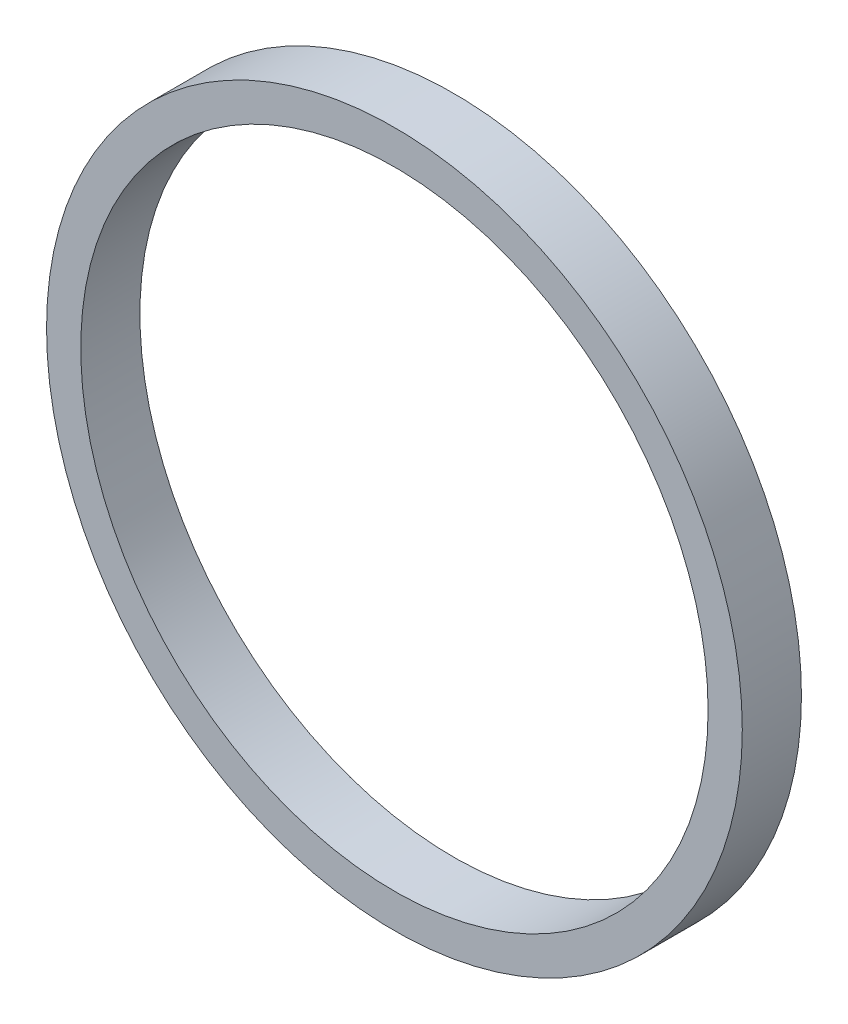
ISO-10303-21;
HEADER;
FILE_DESCRIPTION(('STEP AP214'),'2;1');
FILE_NAME('part.step','',(''),(''),'','','');
FILE_SCHEMA(('AUTOMOTIVE_DESIGN { 1 0 10303 214 1 1 1 1 }'));
ENDSEC;
DATA;
#1=APPLICATION_CONTEXT('core data for automotive mechanical design processes');
#2=APPLICATION_PROTOCOL_DEFINITION('international standard','automotive_design',2000,#1);
#3=PRODUCT_CONTEXT('',#1,'mechanical');
#4=PRODUCT('Part','Part','',(#3));
#5=PRODUCT_RELATED_PRODUCT_CATEGORY('part','',(#4));
#6=PRODUCT_DEFINITION_FORMATION('','',#4);
#7=PRODUCT_DEFINITION_CONTEXT('part definition',#1,'design');
#8=PRODUCT_DEFINITION('design','',#6,#7);
#9=PRODUCT_DEFINITION_SHAPE('','',#8);
#10=(LENGTH_UNIT() NAMED_UNIT(*) SI_UNIT(.MILLI.,.METRE.));
#11=(NAMED_UNIT(*) PLANE_ANGLE_UNIT() SI_UNIT($,.RADIAN.));
#12=(NAMED_UNIT(*) SI_UNIT($,.STERADIAN.) SOLID_ANGLE_UNIT());
#13=UNCERTAINTY_MEASURE_WITH_UNIT(LENGTH_MEASURE(1.E-05),#10,'distance_accuracy_value','');
#14=(GEOMETRIC_REPRESENTATION_CONTEXT(3) GLOBAL_UNCERTAINTY_ASSIGNED_CONTEXT((#13)) GLOBAL_UNIT_ASSIGNED_CONTEXT((#10,
#11,#12)) REPRESENTATION_CONTEXT('',''));
#15=CARTESIAN_POINT('',(0.,0.,0.));
#16=DIRECTION('',(0.,0.,1.));
#17=DIRECTION('',(1.,0.,0.));
#18=AXIS2_PLACEMENT_3D('',#15,#16,#17);
#19=CARTESIAN_POINT('',(0.,25.05,2.3622));
#20=DIRECTION('',(0.,0.,-1.));
#21=DIRECTION('',(-1.,0.,0.));
#22=AXIS2_PLACEMENT_3D('',#19,#20,#21);
#23=PLANE('',#22);
#24=CARTESIAN_POINT('',(0.,0.,2.3622));
#25=DIRECTION('',(0.,0.,1.));
#26=DIRECTION('',(1.,0.,0.));
#27=AXIS2_PLACEMENT_3D('',#24,#25,#26);
#28=CIRCLE('',#27,25.05);
#29=CARTESIAN_POINT('',(25.05,0.,2.3622));
#30=VERTEX_POINT('',#29);
#31=EDGE_CURVE('E46',#30,#30,#28,.T.);
#32=ORIENTED_EDGE('',*,*,#31,.F.);
#33=EDGE_LOOP('',(#32));
#34=FACE_BOUND('',#33,.T.);
#35=CARTESIAN_POINT('',(0.,0.,2.3622));
#36=DIRECTION('',(0.,0.,1.));
#37=DIRECTION('',(1.,0.,0.));
#38=AXIS2_PLACEMENT_3D('',#35,#36,#37);
#39=CIRCLE('',#38,27.78125);
#40=CARTESIAN_POINT('',(27.78125,0.,2.3622));
#41=VERTEX_POINT('',#40);
#42=EDGE_CURVE('E10',#41,#41,#39,.T.);
#43=ORIENTED_EDGE('',*,*,#42,.T.);
#44=EDGE_LOOP('',(#43));
#45=FACE_BOUND('',#44,.T.);
#46=ADVANCED_FACE('F32',(#34,#45),#23,.F.);
#47=CARTESIAN_POINT('',(0.,0.,35.6270308501065));
#48=DIRECTION('',(0.,0.,1.));
#49=DIRECTION('',(1.,0.,0.));
#50=AXIS2_PLACEMENT_3D('',#47,#48,#49);
#51=CYLINDRICAL_SURFACE('',#50,27.78125);
#52=ORIENTED_EDGE('',*,*,#42,.F.);
#53=EDGE_LOOP('',(#52));
#54=FACE_BOUND('',#53,.T.);
#55=CARTESIAN_POINT('',(0.,0.,-2.3622));
#56=DIRECTION('',(0.,0.,1.));
#57=DIRECTION('',(1.,0.,0.));
#58=AXIS2_PLACEMENT_3D('',#55,#56,#57);
#59=CIRCLE('',#58,27.78125);
#60=CARTESIAN_POINT('',(27.78125,0.,-2.3622));
#61=VERTEX_POINT('',#60);
#62=EDGE_CURVE('E38',#61,#61,#59,.T.);
#63=ORIENTED_EDGE('',*,*,#62,.T.);
#64=EDGE_LOOP('',(#63));
#65=FACE_BOUND('',#64,.T.);
#66=ADVANCED_FACE('F55',(#54,#65),#51,.T.);
#67=CARTESIAN_POINT('',(0.,25.05,-2.3622));
#68=DIRECTION('',(0.,0.,1.));
#69=DIRECTION('',(1.,0.,0.));
#70=AXIS2_PLACEMENT_3D('',#67,#68,#69);
#71=PLANE('',#70);
#72=ORIENTED_EDGE('',*,*,#62,.F.);
#73=EDGE_LOOP('',(#72));
#74=FACE_BOUND('',#73,.T.);
#75=CARTESIAN_POINT('',(0.,0.,-2.3622));
#76=DIRECTION('',(0.,0.,1.));
#77=DIRECTION('',(1.,0.,0.));
#78=AXIS2_PLACEMENT_3D('',#75,#76,#77);
#79=CIRCLE('',#78,25.05);
#80=CARTESIAN_POINT('',(25.05,0.,-2.3622));
#81=VERTEX_POINT('',#80);
#82=EDGE_CURVE('E42',#81,#81,#79,.T.);
#83=ORIENTED_EDGE('',*,*,#82,.T.);
#84=EDGE_LOOP('',(#83));
#85=FACE_BOUND('',#84,.T.);
#86=ADVANCED_FACE('F59',(#74,#85),#71,.F.);
#87=CARTESIAN_POINT('',(0.,0.,35.6270308501065));
#88=DIRECTION('',(0.,0.,1.));
#89=DIRECTION('',(1.,0.,0.));
#90=AXIS2_PLACEMENT_3D('',#87,#88,#89);
#91=CYLINDRICAL_SURFACE('',#90,25.05);
#92=ORIENTED_EDGE('',*,*,#82,.F.);
#93=EDGE_LOOP('',(#92));
#94=FACE_BOUND('',#93,.T.);
#95=ORIENTED_EDGE('',*,*,#31,.T.);
#96=EDGE_LOOP('',(#95));
#97=FACE_BOUND('',#96,.T.);
#98=ADVANCED_FACE('F52',(#94,#97),#91,.F.);
#99=CLOSED_SHELL('',(#46,#66,#86,#98));
#100=MANIFOLD_SOLID_BREP('B2',#99);
#101=ADVANCED_BREP_SHAPE_REPRESENTATION('',(#18,#100),#14);
#102=SHAPE_DEFINITION_REPRESENTATION(#9,#101);
ENDSEC;
END-ISO-10303-21;
